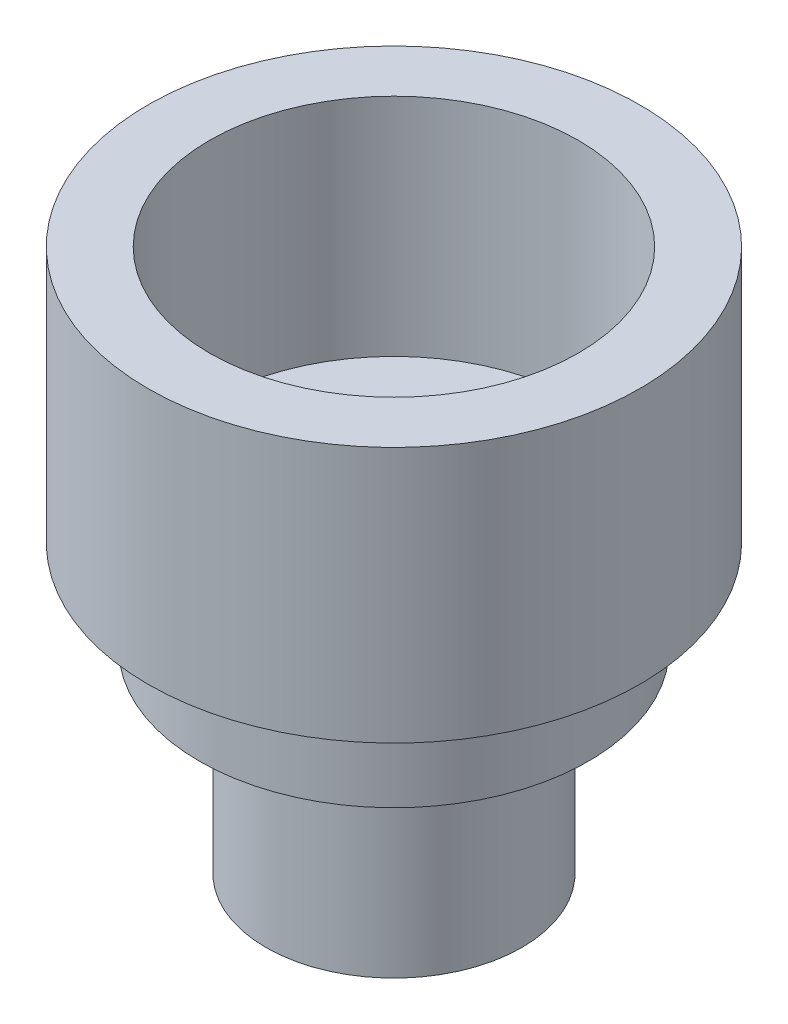
ISO-10303-21;
HEADER;
FILE_DESCRIPTION(('STEP AP214'),'2;1');
FILE_NAME('part.step','',(''),(''),'','','');
FILE_SCHEMA(('AUTOMOTIVE_DESIGN { 1 0 10303 214 1 1 1 1 }'));
ENDSEC;
DATA;
#1=APPLICATION_CONTEXT('core data for automotive mechanical design processes');
#2=APPLICATION_PROTOCOL_DEFINITION('international standard','automotive_design',2000,#1);
#3=PRODUCT_CONTEXT('',#1,'mechanical');
#4=PRODUCT('Part','Part','',(#3));
#5=PRODUCT_RELATED_PRODUCT_CATEGORY('part','',(#4));
#6=PRODUCT_DEFINITION_FORMATION('','',#4);
#7=PRODUCT_DEFINITION_CONTEXT('part definition',#1,'design');
#8=PRODUCT_DEFINITION('design','',#6,#7);
#9=PRODUCT_DEFINITION_SHAPE('','',#8);
#10=(LENGTH_UNIT() NAMED_UNIT(*) SI_UNIT(.MILLI.,.METRE.));
#11=(NAMED_UNIT(*) PLANE_ANGLE_UNIT() SI_UNIT($,.RADIAN.));
#12=(NAMED_UNIT(*) SI_UNIT($,.STERADIAN.) SOLID_ANGLE_UNIT());
#13=UNCERTAINTY_MEASURE_WITH_UNIT(LENGTH_MEASURE(1.E-05),#10,'distance_accuracy_value','');
#14=(GEOMETRIC_REPRESENTATION_CONTEXT(3) GLOBAL_UNCERTAINTY_ASSIGNED_CONTEXT((#13)) GLOBAL_UNIT_ASSIGNED_CONTEXT((#10,
#11,#12)) REPRESENTATION_CONTEXT('',''));
#15=CARTESIAN_POINT('',(0.,0.,0.));
#16=DIRECTION('',(0.,0.,1.));
#17=DIRECTION('',(1.,0.,0.));
#18=AXIS2_PLACEMENT_3D('',#15,#16,#17);
#19=CARTESIAN_POINT('',(0.,1.9,0.));
#20=DIRECTION('',(0.,-1.,0.));
#21=DIRECTION('',(0.,0.,-1.));
#22=AXIS2_PLACEMENT_3D('',#19,#20,#21);
#23=CYLINDRICAL_SURFACE('',#22,1.25);
#24=CARTESIAN_POINT('',(0.,1.9,0.));
#25=DIRECTION('',(0.,1.,0.));
#26=DIRECTION('',(0.,0.,1.));
#27=AXIS2_PLACEMENT_3D('',#24,#25,#26);
#28=CIRCLE('',#27,1.25);
#29=CARTESIAN_POINT('',(0.,1.9,-1.25));
#30=VERTEX_POINT('',#29);
#31=EDGE_CURVE('E11',#30,#30,#28,.T.);
#32=CARTESIAN_POINT('',(0.,0.,0.));
#33=DIRECTION('',(0.,1.,0.));
#34=DIRECTION('',(0.,0.,1.));
#35=AXIS2_PLACEMENT_3D('',#32,#33,#34);
#36=CIRCLE('',#35,1.25);
#37=CARTESIAN_POINT('',(0.,0.,-1.25));
#38=VERTEX_POINT('',#37);
#39=EDGE_CURVE('E42',#38,#38,#36,.T.);
#40=CARTESIAN_POINT('',(0.,1.9,-1.25));
#41=CARTESIAN_POINT('',(0.,1.88020833333333,-1.25));
#42=CARTESIAN_POINT('',(0.,1.86041666666667,-1.25));
#43=CARTESIAN_POINT('',(0.,1.82083333333333,-1.25));
#44=CARTESIAN_POINT('',(0.,1.80104166666667,-1.25));
#45=CARTESIAN_POINT('',(0.,1.76145833333333,-1.25));
#46=CARTESIAN_POINT('',(0.,1.74166666666667,-1.25));
#47=CARTESIAN_POINT('',(0.,1.70208333333333,-1.25));
#48=CARTESIAN_POINT('',(0.,1.68229166666667,-1.25));
#49=CARTESIAN_POINT('',(0.,1.64270833333333,-1.25));
#50=CARTESIAN_POINT('',(0.,1.62291666666667,-1.25));
#51=CARTESIAN_POINT('',(0.,1.58333333333333,-1.25));
#52=CARTESIAN_POINT('',(0.,1.56354166666667,-1.25));
#53=CARTESIAN_POINT('',(0.,1.52395833333333,-1.25));
#54=CARTESIAN_POINT('',(0.,1.50416666666667,-1.25));
#55=CARTESIAN_POINT('',(0.,1.46458333333333,-1.25));
#56=CARTESIAN_POINT('',(0.,1.44479166666667,-1.25));
#57=CARTESIAN_POINT('',(0.,1.40520833333333,-1.25));
#58=CARTESIAN_POINT('',(0.,1.38541666666667,-1.25));
#59=CARTESIAN_POINT('',(0.,1.34583333333333,-1.25));
#60=CARTESIAN_POINT('',(0.,1.32604166666667,-1.25));
#61=CARTESIAN_POINT('',(0.,1.28645833333333,-1.25));
#62=CARTESIAN_POINT('',(0.,1.26666666666667,-1.25));
#63=CARTESIAN_POINT('',(0.,1.22708333333333,-1.25));
#64=CARTESIAN_POINT('',(0.,1.20729166666667,-1.25));
#65=CARTESIAN_POINT('',(0.,1.16770833333333,-1.25));
#66=CARTESIAN_POINT('',(0.,1.14791666666667,-1.25));
#67=CARTESIAN_POINT('',(0.,1.10833333333333,-1.25));
#68=CARTESIAN_POINT('',(0.,1.08854166666667,-1.25));
#69=CARTESIAN_POINT('',(0.,1.04895833333333,-1.25));
#70=CARTESIAN_POINT('',(0.,1.02916666666667,-1.25));
#71=CARTESIAN_POINT('',(0.,0.989583333333333,-1.25));
#72=CARTESIAN_POINT('',(0.,0.969791666666666,-1.25));
#73=CARTESIAN_POINT('',(0.,0.930208333333333,-1.25));
#74=CARTESIAN_POINT('',(0.,0.910416666666667,-1.25));
#75=CARTESIAN_POINT('',(0.,0.870833333333333,-1.25));
#76=CARTESIAN_POINT('',(0.,0.851041666666667,-1.25));
#77=CARTESIAN_POINT('',(0.,0.811458333333333,-1.25));
#78=CARTESIAN_POINT('',(0.,0.791666666666667,-1.25));
#79=CARTESIAN_POINT('',(0.,0.752083333333333,-1.25));
#80=CARTESIAN_POINT('',(0.,0.732291666666667,-1.25));
#81=CARTESIAN_POINT('',(0.,0.692708333333333,-1.25));
#82=CARTESIAN_POINT('',(0.,0.672916666666667,-1.25));
#83=CARTESIAN_POINT('',(0.,0.633333333333333,-1.25));
#84=CARTESIAN_POINT('',(0.,0.613541666666667,-1.25));
#85=CARTESIAN_POINT('',(0.,0.573958333333333,-1.25));
#86=CARTESIAN_POINT('',(0.,0.554166666666667,-1.25));
#87=CARTESIAN_POINT('',(0.,0.514583333333334,-1.25));
#88=CARTESIAN_POINT('',(0.,0.494791666666667,-1.25));
#89=CARTESIAN_POINT('',(0.,0.455208333333333,-1.25));
#90=CARTESIAN_POINT('',(0.,0.435416666666667,-1.25));
#91=CARTESIAN_POINT('',(0.,0.395833333333333,-1.25));
#92=CARTESIAN_POINT('',(0.,0.376041666666667,-1.25));
#93=CARTESIAN_POINT('',(0.,0.336458333333333,-1.25));
#94=CARTESIAN_POINT('',(0.,0.316666666666667,-1.25));
#95=CARTESIAN_POINT('',(0.,0.277083333333333,-1.25));
#96=CARTESIAN_POINT('',(0.,0.257291666666667,-1.25));
#97=CARTESIAN_POINT('',(0.,0.217708333333333,-1.25));
#98=CARTESIAN_POINT('',(0.,0.197916666666667,-1.25));
#99=CARTESIAN_POINT('',(0.,0.158333333333333,-1.25));
#100=CARTESIAN_POINT('',(0.,0.138541666666667,-1.25));
#101=CARTESIAN_POINT('',(0.,0.0989583333333333,-1.25));
#102=CARTESIAN_POINT('',(0.,0.0791666666666666,-1.25));
#103=CARTESIAN_POINT('',(0.,0.0395833333333333,-1.25));
#104=CARTESIAN_POINT('',(0.,0.0197916666666666,-1.25));
#105=CARTESIAN_POINT('',(0.,0.,-1.25));
#106=B_SPLINE_CURVE_WITH_KNOTS('',3,(#40,#41,#42,#43,#44,#45,#46,#47,#48,#49,#50,#51,#52,#53,
#54,#55,#56,#57,#58,#59,#60,#61,#62,#63,#64,#65,#66,#67,#68,#69,#70,#71,#72,#73,#74,#75,#76,#77,
#78,#79,#80,#81,#82,#83,#84,#85,#86,#87,#88,#89,#90,#91,#92,#93,#94,#95,#96,#97,#98,#99,#100,
#101,#102,#103,#104,#105),.UNSPECIFIED.,.F.,.F.,(4,2,2,2,2,2,2,2,2,2,2,2,2,2,2,2,2,2,2,2,2,2,2,
2,2,2,2,2,2,2,2,2,4),(0.,0.0593750000000002,0.11875,0.178125,0.2375,0.296875,0.35625,0.415625,
0.475,0.534375,0.59375,0.653125,0.7125,0.771875,0.83125,0.890625,0.95,1.009375,1.06875,1.128125,
1.1875,1.246875,1.30625,1.365625,1.425,1.484375,1.54375,1.603125,1.6625,1.721875,1.78125,
1.840625,1.9),.UNSPECIFIED.);
#107=EDGE_CURVE('BSEAM39',#30,#38,#106,.T.);
#108=ORIENTED_EDGE('',*,*,#31,.F.);
#109=ORIENTED_EDGE('',*,*,#39,.T.);
#110=ORIENTED_EDGE('',*,*,#107,.T.);
#111=ORIENTED_EDGE('',*,*,#107,.F.);
#112=EDGE_LOOP('',(#108,#110,#109,#111));
#113=FACE_BOUND('',#112,.T.);
#114=ADVANCED_FACE('F39',(#113),#23,.T.);
#115=CARTESIAN_POINT('',(0.,0.,0.));
#116=DIRECTION('',(0.,1.,0.));
#117=DIRECTION('',(0.,0.,1.));
#118=AXIS2_PLACEMENT_3D('',#115,#116,#117);
#119=PLANE('',#118);
#120=ORIENTED_EDGE('',*,*,#39,.F.);
#121=EDGE_LOOP('',(#120));
#122=FACE_BOUND('',#121,.T.);
#123=ADVANCED_FACE('F118',(#122),#119,.F.);
#124=CARTESIAN_POINT('',(0.,2.8,0.));
#125=DIRECTION('',(0.,-1.,0.));
#126=DIRECTION('',(0.,0.,-1.));
#127=AXIS2_PLACEMENT_3D('',#124,#125,#126);
#128=CYLINDRICAL_SURFACE('',#127,1.9);
#129=CARTESIAN_POINT('',(0.,2.8,0.));
#130=DIRECTION('',(0.,1.,0.));
#131=DIRECTION('',(0.,0.,1.));
#132=AXIS2_PLACEMENT_3D('',#129,#130,#131);
#133=CIRCLE('',#132,1.9);
#134=CARTESIAN_POINT('',(0.,2.8,1.9));
#135=VERTEX_POINT('',#134);
#136=EDGE_CURVE('E51',#135,#135,#133,.T.);
#137=ORIENTED_EDGE('',*,*,#136,.F.);
#138=EDGE_LOOP('',(#137));
#139=FACE_BOUND('',#138,.T.);
#140=CARTESIAN_POINT('',(0.,1.9,0.));
#141=DIRECTION('',(0.,1.,0.));
#142=DIRECTION('',(0.,0.,1.));
#143=AXIS2_PLACEMENT_3D('',#140,#141,#142);
#144=CIRCLE('',#143,1.9);
#145=CARTESIAN_POINT('',(0.,1.9,1.9));
#146=VERTEX_POINT('',#145);
#147=EDGE_CURVE('E53',#146,#146,#144,.T.);
#148=ORIENTED_EDGE('',*,*,#147,.T.);
#149=EDGE_LOOP('',(#148));
#150=FACE_BOUND('',#149,.T.);
#151=ADVANCED_FACE('F114',(#139,#150),#128,.T.);
#152=CARTESIAN_POINT('',(0.,1.9,0.));
#153=DIRECTION('',(0.,1.,0.));
#154=DIRECTION('',(0.,0.,1.));
#155=AXIS2_PLACEMENT_3D('',#152,#153,#154);
#156=PLANE('',#155);
#157=ORIENTED_EDGE('',*,*,#31,.T.);
#158=EDGE_LOOP('',(#157));
#159=FACE_BOUND('',#158,.T.);
#160=ORIENTED_EDGE('',*,*,#147,.F.);
#161=EDGE_LOOP('',(#160));
#162=FACE_BOUND('',#161,.T.);
#163=ADVANCED_FACE('F108',(#159,#162),#156,.F.);
#164=CARTESIAN_POINT('',(0.,-3.98822509939086,0.));
#165=DIRECTION('',(0.,1.,0.));
#166=DIRECTION('',(0.,0.,1.));
#167=AXIS2_PLACEMENT_3D('',#164,#165,#166);
#168=CYLINDRICAL_SURFACE('',#167,2.4);
#169=CARTESIAN_POINT('',(0.,2.8,0.));
#170=DIRECTION('',(0.,1.,0.));
#171=DIRECTION('',(0.,0.,1.));
#172=AXIS2_PLACEMENT_3D('',#169,#170,#171);
#173=CIRCLE('',#172,2.4);
#174=CARTESIAN_POINT('',(0.,2.8,2.4));
#175=VERTEX_POINT('',#174);
#176=EDGE_CURVE('E57',#175,#175,#173,.F.);
#177=ORIENTED_EDGE('',*,*,#176,.F.);
#178=EDGE_LOOP('',(#177));
#179=FACE_BOUND('',#178,.T.);
#180=CARTESIAN_POINT('',(0.,5.3,0.));
#181=DIRECTION('',(0.,1.,0.));
#182=DIRECTION('',(0.,0.,1.));
#183=AXIS2_PLACEMENT_3D('',#180,#181,#182);
#184=CIRCLE('',#183,2.4);
#185=CARTESIAN_POINT('',(0.,5.3,2.4));
#186=VERTEX_POINT('',#185);
#187=EDGE_CURVE('E64',#186,#186,#184,.T.);
#188=ORIENTED_EDGE('',*,*,#187,.F.);
#189=EDGE_LOOP('',(#188));
#190=FACE_BOUND('',#189,.T.);
#191=ADVANCED_FACE('F103',(#179,#190),#168,.T.);
#192=CARTESIAN_POINT('',(0.,5.3,0.));
#193=DIRECTION('',(0.,1.,0.));
#194=DIRECTION('',(0.,0.,1.));
#195=AXIS2_PLACEMENT_3D('',#192,#193,#194);
#196=PLANE('',#195);
#197=CARTESIAN_POINT('',(0.,5.3,0.));
#198=DIRECTION('',(0.,1.,0.));
#199=DIRECTION('',(0.,0.,1.));
#200=AXIS2_PLACEMENT_3D('',#197,#198,#199);
#201=CIRCLE('',#200,1.8);
#202=CARTESIAN_POINT('',(0.,5.3,1.8));
#203=VERTEX_POINT('',#202);
#204=EDGE_CURVE('E69',#203,#203,#201,.T.);
#205=ORIENTED_EDGE('',*,*,#204,.F.);
#206=EDGE_LOOP('',(#205));
#207=FACE_BOUND('',#206,.T.);
#208=ORIENTED_EDGE('',*,*,#187,.T.);
#209=EDGE_LOOP('',(#208));
#210=FACE_BOUND('',#209,.T.);
#211=ADVANCED_FACE('F100',(#207,#210),#196,.T.);
#212=CARTESIAN_POINT('',(0.,2.8,0.));
#213=DIRECTION('',(0.,1.,0.));
#214=DIRECTION('',(0.,0.,1.));
#215=AXIS2_PLACEMENT_3D('',#212,#213,#214);
#216=PLANE('',#215);
#217=ORIENTED_EDGE('',*,*,#136,.T.);
#218=EDGE_LOOP('',(#217));
#219=FACE_BOUND('',#218,.T.);
#220=ORIENTED_EDGE('',*,*,#176,.T.);
#221=EDGE_LOOP('',(#220));
#222=FACE_BOUND('',#221,.T.);
#223=ADVANCED_FACE('F96',(#219,#222),#216,.F.);
#224=CARTESIAN_POINT('',(0.,3.1,0.));
#225=DIRECTION('',(0.,1.,0.));
#226=DIRECTION('',(0.,0.,1.));
#227=AXIS2_PLACEMENT_3D('',#224,#225,#226);
#228=CYLINDRICAL_SURFACE('',#227,1.8);
#229=CARTESIAN_POINT('',(0.,3.1,0.));
#230=DIRECTION('',(0.,1.,0.));
#231=DIRECTION('',(0.,0.,1.));
#232=AXIS2_PLACEMENT_3D('',#229,#230,#231);
#233=CIRCLE('',#232,1.8);
#234=CARTESIAN_POINT('',(0.,3.1,1.8));
#235=VERTEX_POINT('',#234);
#236=EDGE_CURVE('E68',#235,#235,#233,.T.);
#237=ORIENTED_EDGE('',*,*,#236,.F.);
#238=EDGE_LOOP('',(#237));
#239=FACE_BOUND('',#238,.T.);
#240=ORIENTED_EDGE('',*,*,#204,.T.);
#241=EDGE_LOOP('',(#240));
#242=FACE_BOUND('',#241,.T.);
#243=ADVANCED_FACE('F90',(#239,#242),#228,.F.);
#244=CARTESIAN_POINT('',(0.,3.1,0.));
#245=DIRECTION('',(0.,1.,0.));
#246=DIRECTION('',(0.,0.,1.));
#247=AXIS2_PLACEMENT_3D('',#244,#245,#246);
#248=PLANE('',#247);
#249=CARTESIAN_POINT('',(0.,3.1,0.));
#250=DIRECTION('',(0.,1.,0.));
#251=DIRECTION('',(0.,0.,1.));
#252=AXIS2_PLACEMENT_3D('',#249,#250,#251);
#253=CIRCLE('',#252,1.);
#254=CARTESIAN_POINT('',(0.,3.1,1.));
#255=VERTEX_POINT('',#254);
#256=EDGE_CURVE('E80',#255,#255,#253,.T.);
#257=ORIENTED_EDGE('',*,*,#256,.F.);
#258=EDGE_LOOP('',(#257));
#259=FACE_BOUND('',#258,.T.);
#260=ORIENTED_EDGE('',*,*,#236,.T.);
#261=EDGE_LOOP('',(#260));
#262=FACE_BOUND('',#261,.T.);
#263=ADVANCED_FACE('F87',(#259,#262),#248,.T.);
#264=CARTESIAN_POINT('',(0.,-2.82842712474619,0.));
#265=DIRECTION('',(0.,1.,0.));
#266=DIRECTION('',(0.,0.,1.));
#267=AXIS2_PLACEMENT_3D('',#264,#265,#266);
#268=CYLINDRICAL_SURFACE('',#267,1.);
#269=CARTESIAN_POINT('',(0.,0.2,0.));
#270=DIRECTION('',(0.,1.,0.));
#271=DIRECTION('',(0.,0.,1.));
#272=AXIS2_PLACEMENT_3D('',#269,#270,#271);
#273=CIRCLE('',#272,1.);
#274=CARTESIAN_POINT('',(0.,0.2,1.));
#275=VERTEX_POINT('',#274);
#276=EDGE_CURVE('E73',#275,#275,#273,.F.);
#277=ORIENTED_EDGE('',*,*,#276,.T.);
#278=EDGE_LOOP('',(#277));
#279=FACE_BOUND('',#278,.T.);
#280=ORIENTED_EDGE('',*,*,#256,.T.);
#281=EDGE_LOOP('',(#280));
#282=FACE_BOUND('',#281,.T.);
#283=ADVANCED_FACE('F85',(#279,#282),#268,.F.);
#284=CARTESIAN_POINT('',(0.,0.2,0.));
#285=DIRECTION('',(0.,1.,0.));
#286=DIRECTION('',(0.,0.,1.));
#287=AXIS2_PLACEMENT_3D('',#284,#285,#286);
#288=PLANE('',#287);
#289=ORIENTED_EDGE('',*,*,#276,.F.);
#290=EDGE_LOOP('',(#289));
#291=FACE_BOUND('',#290,.T.);
#292=ADVANCED_FACE('F146',(#291),#288,.T.);
#293=CLOSED_SHELL('',(#114,#123,#151,#163,#191,#211,#223,#243,#263,#283,#292));
#294=MANIFOLD_SOLID_BREP('B2',#293);
#295=ADVANCED_BREP_SHAPE_REPRESENTATION('',(#18,#294),#14);
#296=SHAPE_DEFINITION_REPRESENTATION(#9,#295);
ENDSEC;
END-ISO-10303-21;
